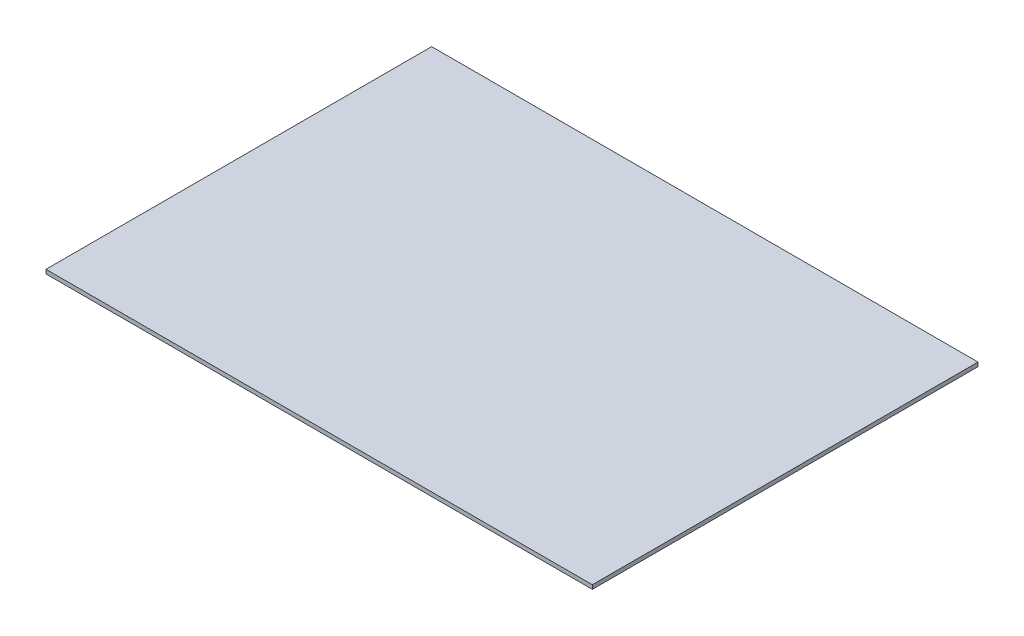
ISO-10303-21;
HEADER;
FILE_DESCRIPTION(('STEP AP214'),'2;1');
FILE_NAME('part.step','',(''),(''),'','','');
FILE_SCHEMA(('AUTOMOTIVE_DESIGN { 1 0 10303 214 1 1 1 1 }'));
ENDSEC;
DATA;
#1=APPLICATION_CONTEXT('core data for automotive mechanical design processes');
#2=APPLICATION_PROTOCOL_DEFINITION('international standard','automotive_design',2000,#1);
#3=PRODUCT_CONTEXT('',#1,'mechanical');
#4=PRODUCT('Part','Part','',(#3));
#5=PRODUCT_RELATED_PRODUCT_CATEGORY('part','',(#4));
#6=PRODUCT_DEFINITION_FORMATION('','',#4);
#7=PRODUCT_DEFINITION_CONTEXT('part definition',#1,'design');
#8=PRODUCT_DEFINITION('design','',#6,#7);
#9=PRODUCT_DEFINITION_SHAPE('','',#8);
#10=(LENGTH_UNIT() NAMED_UNIT(*) SI_UNIT(.MILLI.,.METRE.));
#11=(NAMED_UNIT(*) PLANE_ANGLE_UNIT() SI_UNIT($,.RADIAN.));
#12=(NAMED_UNIT(*) SI_UNIT($,.STERADIAN.) SOLID_ANGLE_UNIT());
#13=UNCERTAINTY_MEASURE_WITH_UNIT(LENGTH_MEASURE(1.E-05),#10,'distance_accuracy_value','');
#14=(GEOMETRIC_REPRESENTATION_CONTEXT(3) GLOBAL_UNCERTAINTY_ASSIGNED_CONTEXT((#13)) GLOBAL_UNIT_ASSIGNED_CONTEXT((#10,
#11,#12)) REPRESENTATION_CONTEXT('',''));
#15=CARTESIAN_POINT('',(0.,0.,0.));
#16=DIRECTION('',(0.,0.,1.));
#17=DIRECTION('',(1.,0.,0.));
#18=AXIS2_PLACEMENT_3D('',#15,#16,#17);
#19=CARTESIAN_POINT('',(-57.4203469662226,3.175,-242.860969299391));
#20=DIRECTION('',(1.,0.,0.));
#21=DIRECTION('',(0.,0.,-1.));
#22=AXIS2_PLACEMENT_3D('',#19,#20,#21);
#23=PLANE('',#22);
#24=DIRECTION('',(0.,0.,1.));
#25=VECTOR('',#24,1.);
#26=CARTESIAN_POINT('',(-57.4203469662226,0.,-242.860969299391));
#27=LINE('',#26,#25);
#28=CARTESIAN_POINT('',(-57.4203469662226,0.,-242.860969299391));
#29=VERTEX_POINT('',#28);
#30=CARTESIAN_POINT('',(-57.4203469662226,0.,61.9390307006086));
#31=VERTEX_POINT('',#30);
#32=EDGE_CURVE('E96',#29,#31,#27,.T.);
#33=ORIENTED_EDGE('',*,*,#32,.T.);
#34=DIRECTION('',(0.,-1.,0.));
#35=VECTOR('',#34,1.);
#36=CARTESIAN_POINT('',(-57.4203469662226,3.175,61.9390307006086));
#37=LINE('',#36,#35);
#38=CARTESIAN_POINT('',(-57.4203469662226,3.175,61.9390307006086));
#39=VERTEX_POINT('',#38);
#40=EDGE_CURVE('E11',#39,#31,#37,.T.);
#41=ORIENTED_EDGE('',*,*,#40,.F.);
#42=DIRECTION('',(0.,0.,1.));
#43=VECTOR('',#42,1.);
#44=CARTESIAN_POINT('',(-57.4203469662226,3.175,-242.860969299391));
#45=LINE('',#44,#43);
#46=CARTESIAN_POINT('',(-57.4203469662226,3.175,-242.860969299391));
#47=VERTEX_POINT('',#46);
#48=EDGE_CURVE('E84',#47,#39,#45,.T.);
#49=ORIENTED_EDGE('',*,*,#48,.F.);
#50=DIRECTION('',(0.,-1.,0.));
#51=VECTOR('',#50,1.);
#52=CARTESIAN_POINT('',(-57.4203469662226,3.175,-242.860969299391));
#53=LINE('',#52,#51);
#54=EDGE_CURVE('E92',#47,#29,#53,.T.);
#55=ORIENTED_EDGE('',*,*,#54,.T.);
#56=EDGE_LOOP('',(#33,#41,#49,#55));
#57=FACE_BOUND('',#56,.T.);
#58=ADVANCED_FACE('F33',(#57),#23,.F.);
#59=CARTESIAN_POINT('',(-57.4203469662226,3.175,61.9390307006086));
#60=DIRECTION('',(0.,0.,-1.));
#61=DIRECTION('',(-1.,0.,0.));
#62=AXIS2_PLACEMENT_3D('',#59,#60,#61);
#63=PLANE('',#62);
#64=DIRECTION('',(1.,0.,0.));
#65=VECTOR('',#64,1.);
#66=CARTESIAN_POINT('',(-57.4203469662226,0.,61.9390307006086));
#67=LINE('',#66,#65);
#68=CARTESIAN_POINT('',(374.379653033777,0.,61.9390307006086));
#69=VERTEX_POINT('',#68);
#70=EDGE_CURVE('E88',#31,#69,#67,.T.);
#71=ORIENTED_EDGE('',*,*,#70,.T.);
#72=DIRECTION('',(0.,-1.,0.));
#73=VECTOR('',#72,1.);
#74=CARTESIAN_POINT('',(374.379653033777,3.175,61.9390307006086));
#75=LINE('',#74,#73);
#76=CARTESIAN_POINT('',(374.379653033777,3.175,61.9390307006086));
#77=VERTEX_POINT('',#76);
#78=EDGE_CURVE('E41',#77,#69,#75,.T.);
#79=ORIENTED_EDGE('',*,*,#78,.F.);
#80=DIRECTION('',(1.,0.,0.));
#81=VECTOR('',#80,1.);
#82=CARTESIAN_POINT('',(-57.4203469662226,3.175,61.9390307006086));
#83=LINE('',#82,#81);
#84=EDGE_CURVE('E79',#39,#77,#83,.T.);
#85=ORIENTED_EDGE('',*,*,#84,.F.);
#86=ORIENTED_EDGE('',*,*,#40,.T.);
#87=EDGE_LOOP('',(#71,#79,#85,#86));
#88=FACE_BOUND('',#87,.T.);
#89=ADVANCED_FACE('F87',(#88),#63,.F.);
#90=CARTESIAN_POINT('',(374.379653033777,3.175,-242.860969299391));
#91=DIRECTION('',(-1.,0.,0.));
#92=DIRECTION('',(0.,0.,1.));
#93=AXIS2_PLACEMENT_3D('',#90,#91,#92);
#94=PLANE('',#93);
#95=DIRECTION('',(0.,0.,-1.));
#96=VECTOR('',#95,1.);
#97=CARTESIAN_POINT('',(374.379653033777,0.,-242.860969299391));
#98=LINE('',#97,#96);
#99=CARTESIAN_POINT('',(374.379653033777,0.,-242.860969299391));
#100=VERTEX_POINT('',#99);
#101=EDGE_CURVE('E66',#69,#100,#98,.T.);
#102=ORIENTED_EDGE('',*,*,#101,.T.);
#103=DIRECTION('',(0.,-1.,0.));
#104=VECTOR('',#103,1.);
#105=CARTESIAN_POINT('',(374.379653033777,3.175,-242.860969299391));
#106=LINE('',#105,#104);
#107=CARTESIAN_POINT('',(374.379653033777,3.175,-242.860969299391));
#108=VERTEX_POINT('',#107);
#109=EDGE_CURVE('E89',#108,#100,#106,.T.);
#110=ORIENTED_EDGE('',*,*,#109,.F.);
#111=DIRECTION('',(0.,0.,-1.));
#112=VECTOR('',#111,1.);
#113=CARTESIAN_POINT('',(374.379653033777,3.175,-242.860969299391));
#114=LINE('',#113,#112);
#115=EDGE_CURVE('E82',#77,#108,#114,.T.);
#116=ORIENTED_EDGE('',*,*,#115,.F.);
#117=ORIENTED_EDGE('',*,*,#78,.T.);
#118=EDGE_LOOP('',(#102,#110,#116,#117));
#119=FACE_BOUND('',#118,.T.);
#120=ADVANCED_FACE('F90',(#119),#94,.F.);
#121=CARTESIAN_POINT('',(-57.4203469662226,3.175,-242.860969299391));
#122=DIRECTION('',(0.,0.,1.));
#123=DIRECTION('',(1.,0.,0.));
#124=AXIS2_PLACEMENT_3D('',#121,#122,#123);
#125=PLANE('',#124);
#126=DIRECTION('',(-1.,0.,0.));
#127=VECTOR('',#126,1.);
#128=CARTESIAN_POINT('',(-57.4203469662226,0.,-242.860969299391));
#129=LINE('',#128,#127);
#130=EDGE_CURVE('E72',#100,#29,#129,.T.);
#131=ORIENTED_EDGE('',*,*,#130,.T.);
#132=ORIENTED_EDGE('',*,*,#54,.F.);
#133=DIRECTION('',(-1.,0.,0.));
#134=VECTOR('',#133,1.);
#135=CARTESIAN_POINT('',(-57.4203469662226,3.175,-242.860969299391));
#136=LINE('',#135,#134);
#137=EDGE_CURVE('E49',#108,#47,#136,.T.);
#138=ORIENTED_EDGE('',*,*,#137,.F.);
#139=ORIENTED_EDGE('',*,*,#109,.T.);
#140=EDGE_LOOP('',(#131,#132,#138,#139));
#141=FACE_BOUND('',#140,.T.);
#142=ADVANCED_FACE('F103',(#141),#125,.F.);
#143=CARTESIAN_POINT('',(0.,3.175,0.));
#144=DIRECTION('',(0.,1.,0.));
#145=DIRECTION('',(0.,0.,1.));
#146=AXIS2_PLACEMENT_3D('',#143,#144,#145);
#147=PLANE('',#146);
#148=ORIENTED_EDGE('',*,*,#48,.T.);
#149=ORIENTED_EDGE('',*,*,#84,.T.);
#150=ORIENTED_EDGE('',*,*,#115,.T.);
#151=ORIENTED_EDGE('',*,*,#137,.T.);
#152=EDGE_LOOP('',(#148,#149,#150,#151));
#153=FACE_BOUND('',#152,.T.);
#154=ADVANCED_FACE('F80',(#153),#147,.T.);
#155=CARTESIAN_POINT('',(0.,0.,0.));
#156=DIRECTION('',(0.,1.,0.));
#157=DIRECTION('',(0.,0.,1.));
#158=AXIS2_PLACEMENT_3D('',#155,#156,#157);
#159=PLANE('',#158);
#160=ORIENTED_EDGE('',*,*,#32,.F.);
#161=ORIENTED_EDGE('',*,*,#130,.F.);
#162=ORIENTED_EDGE('',*,*,#101,.F.);
#163=ORIENTED_EDGE('',*,*,#70,.F.);
#164=EDGE_LOOP('',(#160,#161,#162,#163));
#165=FACE_BOUND('',#164,.T.);
#166=ADVANCED_FACE('F106',(#165),#159,.F.);
#167=CLOSED_SHELL('',(#58,#89,#120,#142,#154,#166));
#168=MANIFOLD_SOLID_BREP('B2',#167);
#169=ADVANCED_BREP_SHAPE_REPRESENTATION('',(#18,#168),#14);
#170=SHAPE_DEFINITION_REPRESENTATION(#9,#169);
ENDSEC;
END-ISO-10303-21;
